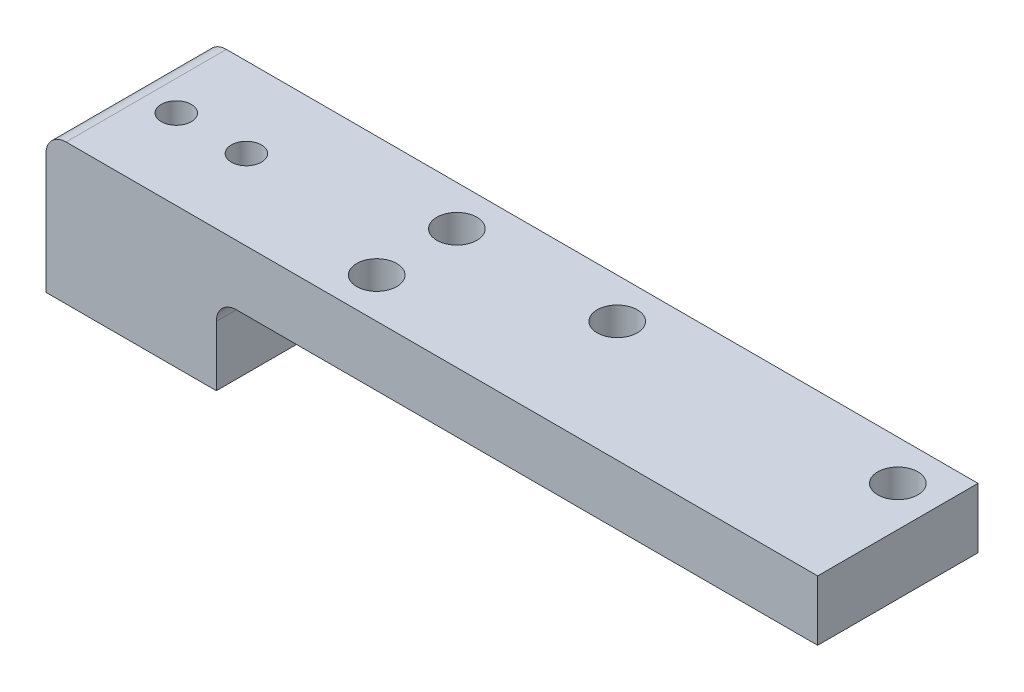
ISO-10303-21;
HEADER;
FILE_DESCRIPTION(('STEP AP214'),'2;1');
FILE_NAME('part.step','',(''),(''),'','','');
FILE_SCHEMA(('AUTOMOTIVE_DESIGN { 1 0 10303 214 1 1 1 1 }'));
ENDSEC;
DATA;
#1=APPLICATION_CONTEXT('core data for automotive mechanical design processes');
#2=APPLICATION_PROTOCOL_DEFINITION('international standard','automotive_design',2000,#1);
#3=PRODUCT_CONTEXT('',#1,'mechanical');
#4=PRODUCT('Part','Part','',(#3));
#5=PRODUCT_RELATED_PRODUCT_CATEGORY('part','',(#4));
#6=PRODUCT_DEFINITION_FORMATION('','',#4);
#7=PRODUCT_DEFINITION_CONTEXT('part definition',#1,'design');
#8=PRODUCT_DEFINITION('design','',#6,#7);
#9=PRODUCT_DEFINITION_SHAPE('','',#8);
#10=(LENGTH_UNIT() NAMED_UNIT(*) SI_UNIT(.MILLI.,.METRE.));
#11=(NAMED_UNIT(*) PLANE_ANGLE_UNIT() SI_UNIT($,.RADIAN.));
#12=(NAMED_UNIT(*) SI_UNIT($,.STERADIAN.) SOLID_ANGLE_UNIT());
#13=UNCERTAINTY_MEASURE_WITH_UNIT(LENGTH_MEASURE(1.E-05),#10,'distance_accuracy_value','');
#14=(GEOMETRIC_REPRESENTATION_CONTEXT(3) GLOBAL_UNCERTAINTY_ASSIGNED_CONTEXT((#13)) GLOBAL_UNIT_ASSIGNED_CONTEXT((#10,
#11,#12)) REPRESENTATION_CONTEXT('',''));
#15=CARTESIAN_POINT('',(0.,0.,0.));
#16=DIRECTION('',(0.,0.,1.));
#17=DIRECTION('',(1.,0.,0.));
#18=AXIS2_PLACEMENT_3D('',#15,#16,#17);
#19=CARTESIAN_POINT('',(8.5,14.,-8.));
#20=DIRECTION('',(-1.,0.,0.));
#21=DIRECTION('',(0.,0.,1.));
#22=AXIS2_PLACEMENT_3D('',#19,#20,#21);
#23=PLANE('',#22);
#24=DIRECTION('',(0.,-1.,0.));
#25=VECTOR('',#24,1.);
#26=CARTESIAN_POINT('',(8.5,14.,-8.));
#27=LINE('',#26,#25);
#28=CARTESIAN_POINT('',(8.5,6.,-8.));
#29=VERTEX_POINT('',#28);
#30=CARTESIAN_POINT('',(8.5,0.,-8.));
#31=VERTEX_POINT('',#30);
#32=EDGE_CURVE('E184',#29,#31,#27,.T.);
#33=ORIENTED_EDGE('',*,*,#32,.F.);
#34=DIRECTION('',(0.,0.,-1.));
#35=VECTOR('',#34,1.);
#36=CARTESIAN_POINT('',(8.5,6.,8.));
#37=LINE('',#36,#35);
#38=CARTESIAN_POINT('',(8.5,6.,8.));
#39=VERTEX_POINT('',#38);
#40=EDGE_CURVE('E206',#29,#39,#37,.F.);
#41=ORIENTED_EDGE('',*,*,#40,.T.);
#42=DIRECTION('',(0.,-1.,0.));
#43=VECTOR('',#42,1.);
#44=CARTESIAN_POINT('',(8.5,14.,8.));
#45=LINE('',#44,#43);
#46=CARTESIAN_POINT('',(8.5,0.,8.));
#47=VERTEX_POINT('',#46);
#48=EDGE_CURVE('E161',#39,#47,#45,.T.);
#49=ORIENTED_EDGE('',*,*,#48,.T.);
#50=DIRECTION('',(0.,0.,-1.));
#51=VECTOR('',#50,1.);
#52=CARTESIAN_POINT('',(8.5,0.,-8.));
#53=LINE('',#52,#51);
#54=EDGE_CURVE('E149',#47,#31,#53,.T.);
#55=ORIENTED_EDGE('',*,*,#54,.T.);
#56=EDGE_LOOP('',(#33,#41,#49,#55));
#57=FACE_BOUND('',#56,.T.);
#58=ADVANCED_FACE('F38',(#57),#23,.F.);
#59=CARTESIAN_POINT('',(0.,14.,0.));
#60=DIRECTION('',(0.,1.,0.));
#61=DIRECTION('',(0.,0.,1.));
#62=AXIS2_PLACEMENT_3D('',#59,#60,#61);
#63=PLANE('',#62);
#64=CARTESIAN_POINT('',(20.5,14.,4.));
#65=DIRECTION('',(0.,1.,0.));
#66=DIRECTION('',(0.,0.,1.));
#67=AXIS2_PLACEMENT_3D('',#64,#65,#66);
#68=CIRCLE('',#67,2.00000000000001);
#69=CARTESIAN_POINT('',(20.5,14.,6.));
#70=VERTEX_POINT('',#69);
#71=EDGE_CURVE('E249',#70,#70,#68,.T.);
#72=ORIENTED_EDGE('',*,*,#71,.F.);
#73=EDGE_LOOP('',(#72));
#74=FACE_BOUND('',#73,.T.);
#75=CARTESIAN_POINT('',(20.5,14.,-4.));
#76=DIRECTION('',(0.,1.,0.));
#77=DIRECTION('',(0.,0.,1.));
#78=AXIS2_PLACEMENT_3D('',#75,#76,#77);
#79=CIRCLE('',#78,2.);
#80=CARTESIAN_POINT('',(20.5,14.,-2.));
#81=VERTEX_POINT('',#80);
#82=EDGE_CURVE('E253',#81,#81,#79,.T.);
#83=ORIENTED_EDGE('',*,*,#82,.F.);
#84=EDGE_LOOP('',(#83));
#85=FACE_BOUND('',#84,.T.);
#86=CARTESIAN_POINT('',(64.5,14.,-4.));
#87=DIRECTION('',(0.,1.,0.));
#88=DIRECTION('',(0.,0.,1.));
#89=AXIS2_PLACEMENT_3D('',#86,#87,#88);
#90=CIRCLE('',#89,2.);
#91=CARTESIAN_POINT('',(64.5,14.,-2.00000000000001));
#92=VERTEX_POINT('',#91);
#93=EDGE_CURVE('E248',#92,#92,#90,.T.);
#94=ORIENTED_EDGE('',*,*,#93,.F.);
#95=EDGE_LOOP('',(#94));
#96=FACE_BOUND('',#95,.T.);
#97=CARTESIAN_POINT('',(36.5,14.,-4.));
#98=DIRECTION('',(0.,1.,0.));
#99=DIRECTION('',(0.,0.,1.));
#100=AXIS2_PLACEMENT_3D('',#97,#98,#99);
#101=CIRCLE('',#100,2.);
#102=CARTESIAN_POINT('',(36.5,14.,-2.));
#103=VERTEX_POINT('',#102);
#104=EDGE_CURVE('E193',#103,#103,#101,.T.);
#105=ORIENTED_EDGE('',*,*,#104,.F.);
#106=EDGE_LOOP('',(#105));
#107=FACE_BOUND('',#106,.T.);
#108=CARTESIAN_POINT('',(-3.5,14.,0.));
#109=DIRECTION('',(0.,1.,0.));
#110=DIRECTION('',(0.,0.,1.));
#111=AXIS2_PLACEMENT_3D('',#108,#109,#110);
#112=CIRCLE('',#111,1.5);
#113=CARTESIAN_POINT('',(-3.5,14.,1.5));
#114=VERTEX_POINT('',#113);
#115=EDGE_CURVE('E145',#114,#114,#112,.T.);
#116=ORIENTED_EDGE('',*,*,#115,.F.);
#117=EDGE_LOOP('',(#116));
#118=FACE_BOUND('',#117,.T.);
#119=DIRECTION('',(-1.,0.,0.));
#120=VECTOR('',#119,1.);
#121=CARTESIAN_POINT('',(-8.5,14.,-8.));
#122=LINE('',#121,#120);
#123=CARTESIAN_POINT('',(68.5,14.,-8.));
#124=VERTEX_POINT('',#123);
#125=CARTESIAN_POINT('',(-6.5,14.,-8.));
#126=VERTEX_POINT('',#125);
#127=EDGE_CURVE('E153',#124,#126,#122,.T.);
#128=ORIENTED_EDGE('',*,*,#127,.T.);
#129=DIRECTION('',(0.,0.,1.));
#130=VECTOR('',#129,1.);
#131=CARTESIAN_POINT('',(-6.5,14.,8.));
#132=LINE('',#131,#130);
#133=CARTESIAN_POINT('',(-6.5,14.,8.));
#134=VERTEX_POINT('',#133);
#135=EDGE_CURVE('E214',#126,#134,#132,.T.);
#136=ORIENTED_EDGE('',*,*,#135,.T.);
#137=DIRECTION('',(1.,0.,0.));
#138=VECTOR('',#137,1.);
#139=CARTESIAN_POINT('',(-8.5,14.,8.));
#140=LINE('',#139,#138);
#141=CARTESIAN_POINT('',(68.5,14.,8.));
#142=VERTEX_POINT('',#141);
#143=EDGE_CURVE('E157',#134,#142,#140,.T.);
#144=ORIENTED_EDGE('',*,*,#143,.T.);
#145=DIRECTION('',(0.,0.,1.));
#146=VECTOR('',#145,1.);
#147=CARTESIAN_POINT('',(68.5,14.,8.));
#148=LINE('',#147,#146);
#149=EDGE_CURVE('E122',#124,#142,#148,.T.);
#150=ORIENTED_EDGE('',*,*,#149,.F.);
#151=EDGE_LOOP('',(#128,#136,#144,#150));
#152=FACE_BOUND('',#151,.T.);
#153=CARTESIAN_POINT('',(3.5,14.,0.));
#154=DIRECTION('',(0.,1.,0.));
#155=DIRECTION('',(0.,0.,1.));
#156=AXIS2_PLACEMENT_3D('',#153,#154,#155);
#157=CIRCLE('',#156,1.5);
#158=CARTESIAN_POINT('',(3.5,14.,1.5));
#159=VERTEX_POINT('',#158);
#160=EDGE_CURVE('E136',#159,#159,#157,.T.);
#161=ORIENTED_EDGE('',*,*,#160,.F.);
#162=EDGE_LOOP('',(#161));
#163=FACE_BOUND('',#162,.T.);
#164=ADVANCED_FACE('F222',(#74,#85,#96,#107,#118,#152,#163),#63,.T.);
#165=CARTESIAN_POINT('',(0.,0.,0.));
#166=DIRECTION('',(0.,1.,0.));
#167=DIRECTION('',(0.,0.,1.));
#168=AXIS2_PLACEMENT_3D('',#165,#166,#167);
#169=PLANE('',#168);
#170=ORIENTED_EDGE('',*,*,#54,.F.);
#171=DIRECTION('',(1.,0.,0.));
#172=VECTOR('',#171,1.);
#173=CARTESIAN_POINT('',(-8.5,0.,8.));
#174=LINE('',#173,#172);
#175=CARTESIAN_POINT('',(-8.5,0.,8.));
#176=VERTEX_POINT('',#175);
#177=EDGE_CURVE('E158',#176,#47,#174,.T.);
#178=ORIENTED_EDGE('',*,*,#177,.F.);
#179=DIRECTION('',(0.,0.,1.));
#180=VECTOR('',#179,1.);
#181=CARTESIAN_POINT('',(-8.5,0.,-8.));
#182=LINE('',#181,#180);
#183=CARTESIAN_POINT('',(-8.5,0.,-8.));
#184=VERTEX_POINT('',#183);
#185=EDGE_CURVE('E169',#184,#176,#182,.T.);
#186=ORIENTED_EDGE('',*,*,#185,.F.);
#187=DIRECTION('',(-1.,0.,0.));
#188=VECTOR('',#187,1.);
#189=CARTESIAN_POINT('',(-8.5,0.,-8.));
#190=LINE('',#189,#188);
#191=EDGE_CURVE('E165',#31,#184,#190,.T.);
#192=ORIENTED_EDGE('',*,*,#191,.F.);
#193=EDGE_LOOP('',(#170,#178,#186,#192));
#194=FACE_BOUND('',#193,.T.);
#195=CARTESIAN_POINT('',(-3.5,0.,0.));
#196=DIRECTION('',(0.,1.,0.));
#197=DIRECTION('',(0.,0.,1.));
#198=AXIS2_PLACEMENT_3D('',#195,#196,#197);
#199=CIRCLE('',#198,1.5);
#200=CARTESIAN_POINT('',(-3.5,0.,1.5));
#201=VERTEX_POINT('',#200);
#202=EDGE_CURVE('E143',#201,#201,#199,.T.);
#203=ORIENTED_EDGE('',*,*,#202,.T.);
#204=EDGE_LOOP('',(#203));
#205=FACE_BOUND('',#204,.T.);
#206=CARTESIAN_POINT('',(3.5,0.,0.));
#207=DIRECTION('',(0.,1.,0.));
#208=DIRECTION('',(0.,0.,1.));
#209=AXIS2_PLACEMENT_3D('',#206,#207,#208);
#210=CIRCLE('',#209,1.5);
#211=CARTESIAN_POINT('',(3.5,0.,1.5));
#212=VERTEX_POINT('',#211);
#213=EDGE_CURVE('E131',#212,#212,#210,.T.);
#214=ORIENTED_EDGE('',*,*,#213,.T.);
#215=EDGE_LOOP('',(#214));
#216=FACE_BOUND('',#215,.T.);
#217=ADVANCED_FACE('F234',(#194,#205,#216),#169,.F.);
#218=CARTESIAN_POINT('',(-8.5,14.,-8.));
#219=DIRECTION('',(0.,0.,1.));
#220=DIRECTION('',(1.,0.,0.));
#221=AXIS2_PLACEMENT_3D('',#218,#219,#220);
#222=PLANE('',#221);
#223=DIRECTION('',(0.,-1.,0.));
#224=VECTOR('',#223,1.);
#225=CARTESIAN_POINT('',(-8.5,14.,-8.));
#226=LINE('',#225,#224);
#227=CARTESIAN_POINT('',(-8.5,12.,-8.));
#228=VERTEX_POINT('',#227);
#229=EDGE_CURVE('E181',#228,#184,#226,.T.);
#230=ORIENTED_EDGE('',*,*,#229,.F.);
#231=CARTESIAN_POINT('',(-6.5,12.,-8.));
#232=DIRECTION('',(0.,0.,1.));
#233=DIRECTION('',(1.,0.,0.));
#234=AXIS2_PLACEMENT_3D('',#231,#232,#233);
#235=CIRCLE('',#234,2.);
#236=EDGE_CURVE('E11',#228,#126,#235,.F.);
#237=ORIENTED_EDGE('',*,*,#236,.T.);
#238=ORIENTED_EDGE('',*,*,#127,.F.);
#239=DIRECTION('',(0.,1.,0.));
#240=VECTOR('',#239,1.);
#241=CARTESIAN_POINT('',(68.5,14.,-8.));
#242=LINE('',#241,#240);
#243=CARTESIAN_POINT('',(68.5,8.,-8.));
#244=VERTEX_POINT('',#243);
#245=EDGE_CURVE('E115',#244,#124,#242,.T.);
#246=ORIENTED_EDGE('',*,*,#245,.F.);
#247=DIRECTION('',(-1.,0.,0.));
#248=VECTOR('',#247,1.);
#249=CARTESIAN_POINT('',(68.5,8.,-8.));
#250=LINE('',#249,#248);
#251=CARTESIAN_POINT('',(10.5,8.,-8.));
#252=VERTEX_POINT('',#251);
#253=EDGE_CURVE('E110',#244,#252,#250,.T.);
#254=ORIENTED_EDGE('',*,*,#253,.T.);
#255=CARTESIAN_POINT('',(10.5,6.,-8.00000000000001));
#256=DIRECTION('',(0.,0.,1.));
#257=DIRECTION('',(1.,0.,0.));
#258=AXIS2_PLACEMENT_3D('',#255,#256,#257);
#259=CIRCLE('',#258,2.);
#260=EDGE_CURVE('E209',#252,#29,#259,.T.);
#261=ORIENTED_EDGE('',*,*,#260,.T.);
#262=ORIENTED_EDGE('',*,*,#32,.T.);
#263=ORIENTED_EDGE('',*,*,#191,.T.);
#264=EDGE_LOOP('',(#230,#237,#238,#246,#254,#261,#262,#263));
#265=FACE_BOUND('',#264,.T.);
#266=ADVANCED_FACE('F227',(#265),#222,.F.);
#267=CARTESIAN_POINT('',(-8.5,14.,-8.));
#268=DIRECTION('',(1.,0.,0.));
#269=DIRECTION('',(0.,0.,-1.));
#270=AXIS2_PLACEMENT_3D('',#267,#268,#269);
#271=PLANE('',#270);
#272=DIRECTION('',(0.,-1.,0.));
#273=VECTOR('',#272,1.);
#274=CARTESIAN_POINT('',(-8.5,14.,8.));
#275=LINE('',#274,#273);
#276=CARTESIAN_POINT('',(-8.5,12.,8.));
#277=VERTEX_POINT('',#276);
#278=EDGE_CURVE('E178',#277,#176,#275,.T.);
#279=ORIENTED_EDGE('',*,*,#278,.F.);
#280=DIRECTION('',(0.,0.,1.));
#281=VECTOR('',#280,1.);
#282=CARTESIAN_POINT('',(-8.5,12.,-8.));
#283=LINE('',#282,#281);
#284=EDGE_CURVE('E47',#277,#228,#283,.F.);
#285=ORIENTED_EDGE('',*,*,#284,.T.);
#286=ORIENTED_EDGE('',*,*,#229,.T.);
#287=ORIENTED_EDGE('',*,*,#185,.T.);
#288=EDGE_LOOP('',(#279,#285,#286,#287));
#289=FACE_BOUND('',#288,.T.);
#290=ADVANCED_FACE('F230',(#289),#271,.F.);
#291=CARTESIAN_POINT('',(-8.5,14.,8.));
#292=DIRECTION('',(0.,0.,-1.));
#293=DIRECTION('',(-1.,0.,0.));
#294=AXIS2_PLACEMENT_3D('',#291,#292,#293);
#295=PLANE('',#294);
#296=ORIENTED_EDGE('',*,*,#143,.F.);
#297=CARTESIAN_POINT('',(-6.5,12.,8.));
#298=DIRECTION('',(0.,0.,-1.));
#299=DIRECTION('',(-1.,0.,0.));
#300=AXIS2_PLACEMENT_3D('',#297,#298,#299);
#301=CIRCLE('',#300,2.);
#302=EDGE_CURVE('E61',#134,#277,#301,.F.);
#303=ORIENTED_EDGE('',*,*,#302,.T.);
#304=ORIENTED_EDGE('',*,*,#278,.T.);
#305=ORIENTED_EDGE('',*,*,#177,.T.);
#306=ORIENTED_EDGE('',*,*,#48,.F.);
#307=CARTESIAN_POINT('',(10.5,6.,8.));
#308=DIRECTION('',(0.,0.,-1.));
#309=DIRECTION('',(-1.,0.,0.));
#310=AXIS2_PLACEMENT_3D('',#307,#308,#309);
#311=CIRCLE('',#310,2.);
#312=CARTESIAN_POINT('',(10.5,8.,8.));
#313=VERTEX_POINT('',#312);
#314=EDGE_CURVE('E129',#39,#313,#311,.T.);
#315=ORIENTED_EDGE('',*,*,#314,.T.);
#316=DIRECTION('',(-1.,0.,0.));
#317=VECTOR('',#316,1.);
#318=CARTESIAN_POINT('',(68.5,8.,8.));
#319=LINE('',#318,#317);
#320=CARTESIAN_POINT('',(68.5,8.,8.));
#321=VERTEX_POINT('',#320);
#322=EDGE_CURVE('E107',#321,#313,#319,.T.);
#323=ORIENTED_EDGE('',*,*,#322,.F.);
#324=DIRECTION('',(0.,-1.,0.));
#325=VECTOR('',#324,1.);
#326=CARTESIAN_POINT('',(68.5,14.,8.));
#327=LINE('',#326,#325);
#328=EDGE_CURVE('E116',#142,#321,#327,.T.);
#329=ORIENTED_EDGE('',*,*,#328,.F.);
#330=EDGE_LOOP('',(#296,#303,#304,#305,#306,#315,#323,#329));
#331=FACE_BOUND('',#330,.T.);
#332=ADVANCED_FACE('F126',(#331),#295,.F.);
#333=CARTESIAN_POINT('',(-3.5,14.,0.));
#334=DIRECTION('',(0.,-1.,0.));
#335=DIRECTION('',(0.,0.,-1.));
#336=AXIS2_PLACEMENT_3D('',#333,#334,#335);
#337=CYLINDRICAL_SURFACE('',#336,1.5);
#338=ORIENTED_EDGE('',*,*,#115,.T.);
#339=EDGE_LOOP('',(#338));
#340=FACE_BOUND('',#339,.T.);
#341=ORIENTED_EDGE('',*,*,#202,.F.);
#342=EDGE_LOOP('',(#341));
#343=FACE_BOUND('',#342,.T.);
#344=ADVANCED_FACE('F272',(#340,#343),#337,.F.);
#345=CARTESIAN_POINT('',(3.5,14.,0.));
#346=DIRECTION('',(0.,-1.,0.));
#347=DIRECTION('',(0.,0.,-1.));
#348=AXIS2_PLACEMENT_3D('',#345,#346,#347);
#349=CYLINDRICAL_SURFACE('',#348,1.5);
#350=ORIENTED_EDGE('',*,*,#160,.T.);
#351=EDGE_LOOP('',(#350));
#352=FACE_BOUND('',#351,.T.);
#353=ORIENTED_EDGE('',*,*,#213,.F.);
#354=EDGE_LOOP('',(#353));
#355=FACE_BOUND('',#354,.T.);
#356=ADVANCED_FACE('F275',(#352,#355),#349,.F.);
#357=CARTESIAN_POINT('',(68.5,8.,8.));
#358=DIRECTION('',(0.,1.,0.));
#359=DIRECTION('',(0.,0.,1.));
#360=AXIS2_PLACEMENT_3D('',#357,#358,#359);
#361=PLANE('',#360);
#362=CARTESIAN_POINT('',(20.5,8.,4.));
#363=DIRECTION('',(0.,1.,0.));
#364=DIRECTION('',(0.,0.,1.));
#365=AXIS2_PLACEMENT_3D('',#362,#363,#364);
#366=CIRCLE('',#365,2.00000000000001);
#367=CARTESIAN_POINT('',(20.5,8.,6.));
#368=VERTEX_POINT('',#367);
#369=EDGE_CURVE('E124',#368,#368,#366,.T.);
#370=ORIENTED_EDGE('',*,*,#369,.T.);
#371=EDGE_LOOP('',(#370));
#372=FACE_BOUND('',#371,.T.);
#373=CARTESIAN_POINT('',(20.5,8.,-4.));
#374=DIRECTION('',(0.,1.,0.));
#375=DIRECTION('',(0.,0.,1.));
#376=AXIS2_PLACEMENT_3D('',#373,#374,#375);
#377=CIRCLE('',#376,2.);
#378=CARTESIAN_POINT('',(20.5,8.,-2.));
#379=VERTEX_POINT('',#378);
#380=EDGE_CURVE('E197',#379,#379,#377,.T.);
#381=ORIENTED_EDGE('',*,*,#380,.T.);
#382=EDGE_LOOP('',(#381));
#383=FACE_BOUND('',#382,.T.);
#384=CARTESIAN_POINT('',(64.5,8.,-4.));
#385=DIRECTION('',(0.,1.,0.));
#386=DIRECTION('',(0.,0.,1.));
#387=AXIS2_PLACEMENT_3D('',#384,#385,#386);
#388=CIRCLE('',#387,2.);
#389=CARTESIAN_POINT('',(64.5,8.,-2.00000000000001));
#390=VERTEX_POINT('',#389);
#391=EDGE_CURVE('E192',#390,#390,#388,.T.);
#392=ORIENTED_EDGE('',*,*,#391,.T.);
#393=EDGE_LOOP('',(#392));
#394=FACE_BOUND('',#393,.T.);
#395=CARTESIAN_POINT('',(36.5,8.,-4.));
#396=DIRECTION('',(0.,1.,0.));
#397=DIRECTION('',(0.,0.,1.));
#398=AXIS2_PLACEMENT_3D('',#395,#396,#397);
#399=CIRCLE('',#398,2.);
#400=CARTESIAN_POINT('',(36.5,8.,-2.));
#401=VERTEX_POINT('',#400);
#402=EDGE_CURVE('E188',#401,#401,#399,.T.);
#403=ORIENTED_EDGE('',*,*,#402,.T.);
#404=EDGE_LOOP('',(#403));
#405=FACE_BOUND('',#404,.T.);
#406=ORIENTED_EDGE('',*,*,#322,.T.);
#407=DIRECTION('',(0.,0.,-1.));
#408=VECTOR('',#407,1.);
#409=CARTESIAN_POINT('',(10.5,8.,-8.));
#410=LINE('',#409,#408);
#411=EDGE_CURVE('E187',#313,#252,#410,.T.);
#412=ORIENTED_EDGE('',*,*,#411,.T.);
#413=ORIENTED_EDGE('',*,*,#253,.F.);
#414=DIRECTION('',(0.,0.,-1.));
#415=VECTOR('',#414,1.);
#416=CARTESIAN_POINT('',(68.5,8.,8.));
#417=LINE('',#416,#415);
#418=EDGE_CURVE('E102',#321,#244,#417,.T.);
#419=ORIENTED_EDGE('',*,*,#418,.F.);
#420=EDGE_LOOP('',(#406,#412,#413,#419));
#421=FACE_BOUND('',#420,.T.);
#422=ADVANCED_FACE('F104',(#372,#383,#394,#405,#421),#361,.F.);
#423=CARTESIAN_POINT('',(68.5,0.,0.));
#424=DIRECTION('',(1.,0.,0.));
#425=DIRECTION('',(0.,0.,-1.));
#426=AXIS2_PLACEMENT_3D('',#423,#424,#425);
#427=PLANE('',#426);
#428=ORIENTED_EDGE('',*,*,#328,.T.);
#429=ORIENTED_EDGE('',*,*,#418,.T.);
#430=ORIENTED_EDGE('',*,*,#245,.T.);
#431=ORIENTED_EDGE('',*,*,#149,.T.);
#432=EDGE_LOOP('',(#428,#429,#430,#431));
#433=FACE_BOUND('',#432,.T.);
#434=ADVANCED_FACE('F120',(#433),#427,.T.);
#435=CARTESIAN_POINT('',(36.5,0.,-4.));
#436=DIRECTION('',(0.,1.,0.));
#437=DIRECTION('',(0.,0.,1.));
#438=AXIS2_PLACEMENT_3D('',#435,#436,#437);
#439=CYLINDRICAL_SURFACE('',#438,2.);
#440=ORIENTED_EDGE('',*,*,#104,.T.);
#441=EDGE_LOOP('',(#440));
#442=FACE_BOUND('',#441,.T.);
#443=ORIENTED_EDGE('',*,*,#402,.F.);
#444=EDGE_LOOP('',(#443));
#445=FACE_BOUND('',#444,.T.);
#446=ADVANCED_FACE('F315',(#442,#445),#439,.F.);
#447=CARTESIAN_POINT('',(64.5,0.,-4.));
#448=DIRECTION('',(0.,1.,0.));
#449=DIRECTION('',(0.,0.,1.));
#450=AXIS2_PLACEMENT_3D('',#447,#448,#449);
#451=CYLINDRICAL_SURFACE('',#450,2.);
#452=ORIENTED_EDGE('',*,*,#93,.T.);
#453=EDGE_LOOP('',(#452));
#454=FACE_BOUND('',#453,.T.);
#455=ORIENTED_EDGE('',*,*,#391,.F.);
#456=EDGE_LOOP('',(#455));
#457=FACE_BOUND('',#456,.T.);
#458=ADVANCED_FACE('F261',(#454,#457),#451,.F.);
#459=CARTESIAN_POINT('',(20.5,0.,-4.));
#460=DIRECTION('',(0.,1.,0.));
#461=DIRECTION('',(0.,0.,1.));
#462=AXIS2_PLACEMENT_3D('',#459,#460,#461);
#463=CYLINDRICAL_SURFACE('',#462,2.);
#464=ORIENTED_EDGE('',*,*,#82,.T.);
#465=EDGE_LOOP('',(#464));
#466=FACE_BOUND('',#465,.T.);
#467=ORIENTED_EDGE('',*,*,#380,.F.);
#468=EDGE_LOOP('',(#467));
#469=FACE_BOUND('',#468,.T.);
#470=ADVANCED_FACE('F305',(#466,#469),#463,.F.);
#471=CARTESIAN_POINT('',(20.5,0.,4.));
#472=DIRECTION('',(0.,1.,0.));
#473=DIRECTION('',(0.,0.,1.));
#474=AXIS2_PLACEMENT_3D('',#471,#472,#473);
#475=CYLINDRICAL_SURFACE('',#474,2.00000000000001);
#476=ORIENTED_EDGE('',*,*,#71,.T.);
#477=EDGE_LOOP('',(#476));
#478=FACE_BOUND('',#477,.T.);
#479=ORIENTED_EDGE('',*,*,#369,.F.);
#480=EDGE_LOOP('',(#479));
#481=FACE_BOUND('',#480,.T.);
#482=ADVANCED_FACE('F300',(#478,#481),#475,.F.);
#483=CARTESIAN_POINT('',(10.5,6.,8.));
#484=DIRECTION('',(0.,0.,1.));
#485=DIRECTION('',(1.,0.,0.));
#486=AXIS2_PLACEMENT_3D('',#483,#484,#485);
#487=CYLINDRICAL_SURFACE('',#486,2.);
#488=ORIENTED_EDGE('',*,*,#314,.F.);
#489=ORIENTED_EDGE('',*,*,#40,.F.);
#490=ORIENTED_EDGE('',*,*,#260,.F.);
#491=ORIENTED_EDGE('',*,*,#411,.F.);
#492=EDGE_LOOP('',(#488,#489,#490,#491));
#493=FACE_BOUND('',#492,.T.);
#494=ADVANCED_FACE('F239',(#493),#487,.F.);
#495=CARTESIAN_POINT('',(-6.5,12.,0.));
#496=DIRECTION('',(0.,0.,-1.));
#497=DIRECTION('',(-1.,0.,0.));
#498=AXIS2_PLACEMENT_3D('',#495,#496,#497);
#499=CYLINDRICAL_SURFACE('',#498,2.);
#500=ORIENTED_EDGE('',*,*,#236,.F.);
#501=ORIENTED_EDGE('',*,*,#284,.F.);
#502=ORIENTED_EDGE('',*,*,#302,.F.);
#503=ORIENTED_EDGE('',*,*,#135,.F.);
#504=EDGE_LOOP('',(#500,#501,#502,#503));
#505=FACE_BOUND('',#504,.T.);
#506=ADVANCED_FACE('F40',(#505),#499,.T.);
#507=CLOSED_SHELL('',(#58,#164,#217,#266,#290,#332,#344,#356,#422,#434,#446,#458,#470,#482,#494,#506));
#508=MANIFOLD_SOLID_BREP('B2',#507);
#509=ADVANCED_BREP_SHAPE_REPRESENTATION('',(#18,#508),#14);
#510=SHAPE_DEFINITION_REPRESENTATION(#9,#509);
ENDSEC;
END-ISO-10303-21;
